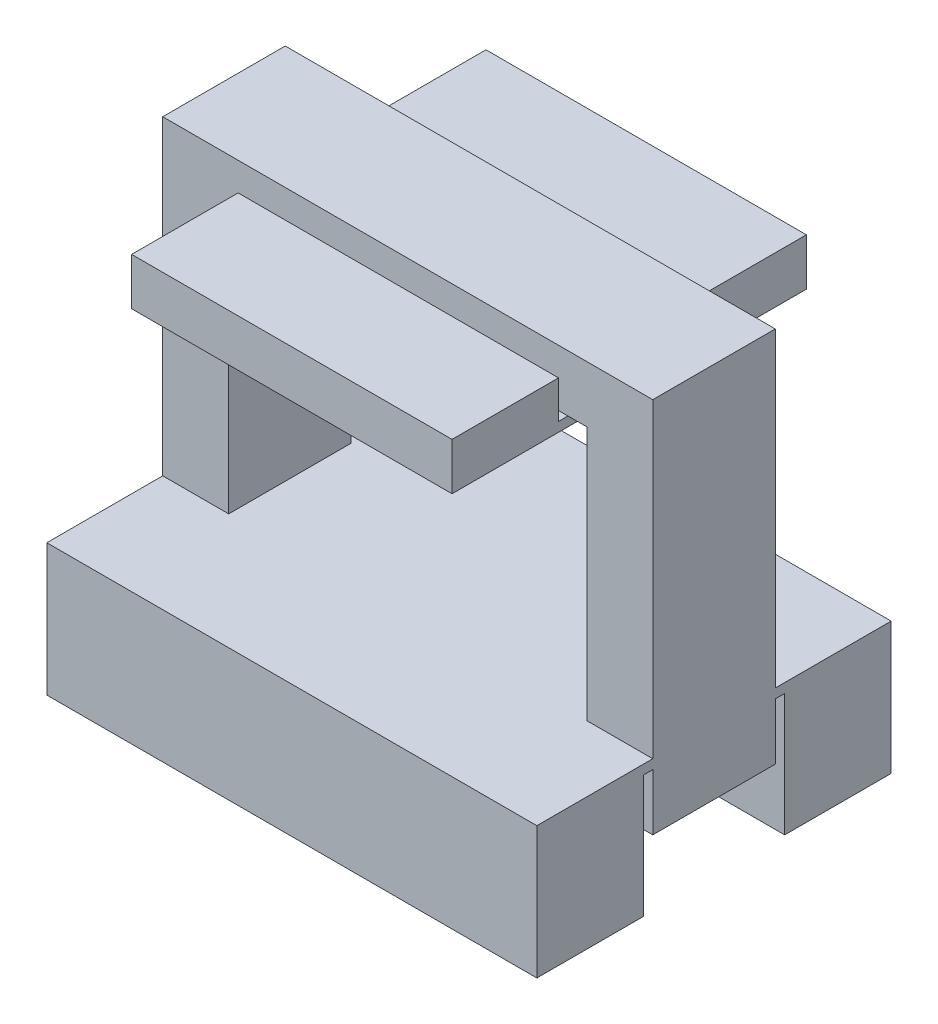
ISO-10303-21;
HEADER;
FILE_DESCRIPTION(('STEP AP214'),'2;1');
FILE_NAME('part.step','',(''),(''),'','','');
FILE_SCHEMA(('AUTOMOTIVE_DESIGN { 1 0 10303 214 1 1 1 1 }'));
ENDSEC;
DATA;
#1=APPLICATION_CONTEXT('core data for automotive mechanical design processes');
#2=APPLICATION_PROTOCOL_DEFINITION('international standard','automotive_design',2000,#1);
#3=PRODUCT_CONTEXT('',#1,'mechanical');
#4=PRODUCT('Part','Part','',(#3));
#5=PRODUCT_RELATED_PRODUCT_CATEGORY('part','',(#4));
#6=PRODUCT_DEFINITION_FORMATION('','',#4);
#7=PRODUCT_DEFINITION_CONTEXT('part definition',#1,'design');
#8=PRODUCT_DEFINITION('design','',#6,#7);
#9=PRODUCT_DEFINITION_SHAPE('','',#8);
#10=(LENGTH_UNIT() NAMED_UNIT(*) SI_UNIT(.MILLI.,.METRE.));
#11=(NAMED_UNIT(*) PLANE_ANGLE_UNIT() SI_UNIT($,.RADIAN.));
#12=(NAMED_UNIT(*) SI_UNIT($,.STERADIAN.) SOLID_ANGLE_UNIT());
#13=UNCERTAINTY_MEASURE_WITH_UNIT(LENGTH_MEASURE(1.E-05),#10,'distance_accuracy_value','');
#14=(GEOMETRIC_REPRESENTATION_CONTEXT(3) GLOBAL_UNCERTAINTY_ASSIGNED_CONTEXT((#13)) GLOBAL_UNIT_ASSIGNED_CONTEXT((#10,
#11,#12)) REPRESENTATION_CONTEXT('',''));
#15=CARTESIAN_POINT('',(0.,0.,0.));
#16=DIRECTION('',(0.,0.,1.));
#17=DIRECTION('',(1.,0.,0.));
#18=AXIS2_PLACEMENT_3D('',#15,#16,#17);
#19=CARTESIAN_POINT('',(13.,-3.5,9.4));
#20=DIRECTION('',(0.,1.,0.));
#21=DIRECTION('',(-1.,0.,0.));
#22=AXIS2_PLACEMENT_3D('',#19,#20,#21);
#23=PLANE('',#22);
#24=DIRECTION('',(0.,0.,-1.));
#25=VECTOR('',#24,1.);
#26=CARTESIAN_POINT('',(13.,-3.5,-9.4));
#27=LINE('',#26,#25);
#28=CARTESIAN_POINT('',(13.,-3.5,-3.75));
#29=VERTEX_POINT('',#28);
#30=CARTESIAN_POINT('',(13.,-3.5,-9.4));
#31=VERTEX_POINT('',#30);
#32=EDGE_CURVE('E314',#29,#31,#27,.T.);
#33=ORIENTED_EDGE('',*,*,#32,.F.);
#34=DIRECTION('',(1.,0.,0.));
#35=VECTOR('',#34,1.);
#36=CARTESIAN_POINT('',(-13.,-3.5,-3.75));
#37=LINE('',#36,#35);
#38=CARTESIAN_POINT('',(-13.,-3.5,-3.75));
#39=VERTEX_POINT('',#38);
#40=EDGE_CURVE('E296',#39,#29,#37,.T.);
#41=ORIENTED_EDGE('',*,*,#40,.F.);
#42=DIRECTION('',(0.,0.,1.));
#43=VECTOR('',#42,1.);
#44=CARTESIAN_POINT('',(-13.,-3.5,-9.4));
#45=LINE('',#44,#43);
#46=CARTESIAN_POINT('',(-13.,-3.5,-9.4));
#47=VERTEX_POINT('',#46);
#48=EDGE_CURVE('E322',#47,#39,#45,.T.);
#49=ORIENTED_EDGE('',*,*,#48,.F.);
#50=DIRECTION('',(-1.,0.,0.));
#51=VECTOR('',#50,1.);
#52=CARTESIAN_POINT('',(-13.,-3.5,-9.4));
#53=LINE('',#52,#51);
#54=EDGE_CURVE('E318',#31,#47,#53,.T.);
#55=ORIENTED_EDGE('',*,*,#54,.F.);
#56=EDGE_LOOP('',(#33,#41,#49,#55));
#57=FACE_BOUND('',#56,.T.);
#58=ADVANCED_FACE('F38',(#57),#23,.F.);
#59=CARTESIAN_POINT('',(9.5,17.,-3.25));
#60=DIRECTION('',(0.,1.,0.));
#61=DIRECTION('',(0.,0.,1.));
#62=AXIS2_PLACEMENT_3D('',#59,#60,#61);
#63=PLANE('',#62);
#64=DIRECTION('',(-1.,0.,0.));
#65=VECTOR('',#64,1.);
#66=CARTESIAN_POINT('',(9.5,17.,3.25));
#67=LINE('',#66,#65);
#68=CARTESIAN_POINT('',(9.5,17.,3.25));
#69=VERTEX_POINT('',#68);
#70=CARTESIAN_POINT('',(8.5,17.,3.25));
#71=VERTEX_POINT('',#70);
#72=EDGE_CURVE('E418',#69,#71,#67,.T.);
#73=ORIENTED_EDGE('',*,*,#72,.T.);
#74=DIRECTION('',(0.,0.,-1.));
#75=VECTOR('',#74,1.);
#76=CARTESIAN_POINT('',(8.5,17.,-3.25));
#77=LINE('',#76,#75);
#78=CARTESIAN_POINT('',(8.5,17.,-3.25));
#79=VERTEX_POINT('',#78);
#80=EDGE_CURVE('E452',#71,#79,#77,.T.);
#81=ORIENTED_EDGE('',*,*,#80,.T.);
#82=DIRECTION('',(-1.,0.,0.));
#83=VECTOR('',#82,1.);
#84=CARTESIAN_POINT('',(9.5,17.,-3.25));
#85=LINE('',#84,#83);
#86=CARTESIAN_POINT('',(9.5,17.,-3.25));
#87=VERTEX_POINT('',#86);
#88=EDGE_CURVE('E409',#87,#79,#85,.T.);
#89=ORIENTED_EDGE('',*,*,#88,.F.);
#90=DIRECTION('',(0.,0.,1.));
#91=VECTOR('',#90,1.);
#92=CARTESIAN_POINT('',(9.5,17.,-3.25));
#93=LINE('',#92,#91);
#94=EDGE_CURVE('E415',#87,#69,#93,.T.);
#95=ORIENTED_EDGE('',*,*,#94,.T.);
#96=EDGE_LOOP('',(#73,#81,#89,#95));
#97=FACE_BOUND('',#96,.T.);
#98=ADVANCED_FACE('F513',(#97),#63,.F.);
#99=CARTESIAN_POINT('',(13.,20.,3.25));
#100=DIRECTION('',(-1.,0.,0.));
#101=DIRECTION('',(0.,0.,1.));
#102=AXIS2_PLACEMENT_3D('',#99,#100,#101);
#103=PLANE('',#102);
#104=DIRECTION('',(0.,0.,1.));
#105=VECTOR('',#104,1.);
#106=CARTESIAN_POINT('',(13.,3.,-3.25));
#107=LINE('',#106,#105);
#108=CARTESIAN_POINT('',(13.,3.,-3.75));
#109=VERTEX_POINT('',#108);
#110=CARTESIAN_POINT('',(13.,3.,-3.25));
#111=VERTEX_POINT('',#110);
#112=EDGE_CURVE('E264',#109,#111,#107,.T.);
#113=ORIENTED_EDGE('',*,*,#112,.F.);
#114=DIRECTION('',(0.,1.,0.));
#115=VECTOR('',#114,1.);
#116=CARTESIAN_POINT('',(13.,3.,-3.75));
#117=LINE('',#116,#115);
#118=EDGE_CURVE('E284',#29,#109,#117,.T.);
#119=ORIENTED_EDGE('',*,*,#118,.F.);
#120=ORIENTED_EDGE('',*,*,#32,.T.);
#121=DIRECTION('',(0.,1.,0.));
#122=VECTOR('',#121,1.);
#123=CARTESIAN_POINT('',(13.,-3.5,-9.4));
#124=LINE('',#123,#122);
#125=CARTESIAN_POINT('',(13.,3.5,-9.4));
#126=VERTEX_POINT('',#125);
#127=EDGE_CURVE('E327',#31,#126,#124,.T.);
#128=ORIENTED_EDGE('',*,*,#127,.T.);
#129=DIRECTION('',(0.,0.,-1.));
#130=VECTOR('',#129,1.);
#131=CARTESIAN_POINT('',(13.,3.5,-9.4));
#132=LINE('',#131,#130);
#133=CARTESIAN_POINT('',(13.,3.5,-3.25));
#134=VERTEX_POINT('',#133);
#135=EDGE_CURVE('E291',#134,#126,#132,.T.);
#136=ORIENTED_EDGE('',*,*,#135,.F.);
#137=DIRECTION('',(0.,-1.,0.));
#138=VECTOR('',#137,1.);
#139=CARTESIAN_POINT('',(13.,20.,-3.25));
#140=LINE('',#139,#138);
#141=CARTESIAN_POINT('',(13.,20.,-3.25));
#142=VERTEX_POINT('',#141);
#143=EDGE_CURVE('E446',#142,#134,#140,.T.);
#144=ORIENTED_EDGE('',*,*,#143,.F.);
#145=DIRECTION('',(0.,0.,-1.));
#146=VECTOR('',#145,1.);
#147=CARTESIAN_POINT('',(13.,20.,3.25));
#148=LINE('',#147,#146);
#149=CARTESIAN_POINT('',(13.,20.,3.25));
#150=VERTEX_POINT('',#149);
#151=EDGE_CURVE('E426',#150,#142,#148,.T.);
#152=ORIENTED_EDGE('',*,*,#151,.F.);
#153=DIRECTION('',(0.,-1.,0.));
#154=VECTOR('',#153,1.);
#155=CARTESIAN_POINT('',(13.,20.,3.25));
#156=LINE('',#155,#154);
#157=CARTESIAN_POINT('',(13.,3.5,3.25));
#158=VERTEX_POINT('',#157);
#159=EDGE_CURVE('E437',#150,#158,#156,.T.);
#160=ORIENTED_EDGE('',*,*,#159,.T.);
#161=CARTESIAN_POINT('',(13.,3.5,9.4));
#162=VERTEX_POINT('',#161);
#163=EDGE_CURVE('E303',#162,#158,#132,.T.);
#164=ORIENTED_EDGE('',*,*,#163,.F.);
#165=DIRECTION('',(0.,1.,0.));
#166=VECTOR('',#165,1.);
#167=CARTESIAN_POINT('',(13.,-3.5,9.4));
#168=LINE('',#167,#166);
#169=CARTESIAN_POINT('',(13.,-3.5,9.4));
#170=VERTEX_POINT('',#169);
#171=EDGE_CURVE('E328',#170,#162,#168,.T.);
#172=ORIENTED_EDGE('',*,*,#171,.F.);
#173=CARTESIAN_POINT('',(13.,-3.5,3.75));
#174=VERTEX_POINT('',#173);
#175=EDGE_CURVE('E315',#170,#174,#27,.T.);
#176=ORIENTED_EDGE('',*,*,#175,.T.);
#177=DIRECTION('',(0.,-1.,0.));
#178=VECTOR('',#177,1.);
#179=CARTESIAN_POINT('',(13.,3.,3.75));
#180=LINE('',#179,#178);
#181=CARTESIAN_POINT('',(13.,3.,3.75));
#182=VERTEX_POINT('',#181);
#183=EDGE_CURVE('E53',#182,#174,#180,.T.);
#184=ORIENTED_EDGE('',*,*,#183,.F.);
#185=DIRECTION('',(0.,0.,1.));
#186=VECTOR('',#185,1.);
#187=CARTESIAN_POINT('',(13.,3.,3.25));
#188=LINE('',#187,#186);
#189=CARTESIAN_POINT('',(13.,3.,3.25));
#190=VERTEX_POINT('',#189);
#191=EDGE_CURVE('E280',#190,#182,#188,.T.);
#192=ORIENTED_EDGE('',*,*,#191,.F.);
#193=DIRECTION('',(0.,1.,0.));
#194=VECTOR('',#193,1.);
#195=CARTESIAN_POINT('',(13.,0.,3.25));
#196=LINE('',#195,#194);
#197=CARTESIAN_POINT('',(13.,0.,3.25));
#198=VERTEX_POINT('',#197);
#199=EDGE_CURVE('E278',#198,#190,#196,.T.);
#200=ORIENTED_EDGE('',*,*,#199,.F.);
#201=DIRECTION('',(0.,0.,1.));
#202=VECTOR('',#201,1.);
#203=CARTESIAN_POINT('',(13.,0.,3.25));
#204=LINE('',#203,#202);
#205=CARTESIAN_POINT('',(13.,0.,-3.25));
#206=VERTEX_POINT('',#205);
#207=EDGE_CURVE('E242',#206,#198,#204,.T.);
#208=ORIENTED_EDGE('',*,*,#207,.F.);
#209=DIRECTION('',(0.,-1.,0.));
#210=VECTOR('',#209,1.);
#211=CARTESIAN_POINT('',(13.,0.,-3.25));
#212=LINE('',#211,#210);
#213=EDGE_CURVE('E261',#111,#206,#212,.T.);
#214=ORIENTED_EDGE('',*,*,#213,.F.);
#215=EDGE_LOOP('',(#113,#119,#120,#128,#136,#144,#152,#160,#164,#172,#176,#184,#192,#200,#208,#214));
#216=FACE_BOUND('',#215,.T.);
#217=ADVANCED_FACE('F40',(#216),#103,.F.);
#218=CARTESIAN_POINT('',(-13.,20.,-3.25));
#219=DIRECTION('',(0.,0.,1.));
#220=DIRECTION('',(1.,0.,0.));
#221=AXIS2_PLACEMENT_3D('',#218,#219,#220);
#222=PLANE('',#221);
#223=ORIENTED_EDGE('',*,*,#143,.T.);
#224=DIRECTION('',(-1.,0.,0.));
#225=VECTOR('',#224,1.);
#226=CARTESIAN_POINT('',(-13.,3.5,-3.25));
#227=LINE('',#226,#225);
#228=CARTESIAN_POINT('',(9.5,3.5,-3.25));
#229=VERTEX_POINT('',#228);
#230=EDGE_CURVE('E344',#134,#229,#227,.T.);
#231=ORIENTED_EDGE('',*,*,#230,.T.);
#232=DIRECTION('',(0.,1.,0.));
#233=VECTOR('',#232,1.);
#234=CARTESIAN_POINT('',(9.5,17.,-3.25));
#235=LINE('',#234,#233);
#236=EDGE_CURVE('E405',#229,#87,#235,.T.);
#237=ORIENTED_EDGE('',*,*,#236,.T.);
#238=ORIENTED_EDGE('',*,*,#88,.T.);
#239=DIRECTION('',(1.,0.,0.));
#240=VECTOR('',#239,1.);
#241=CARTESIAN_POINT('',(-13.,17.,-3.25));
#242=LINE('',#241,#240);
#243=CARTESIAN_POINT('',(-8.5,17.,-3.25));
#244=VERTEX_POINT('',#243);
#245=EDGE_CURVE('E352',#244,#79,#242,.T.);
#246=ORIENTED_EDGE('',*,*,#245,.F.);
#247=CARTESIAN_POINT('',(-9.5,17.,-3.25));
#248=VERTEX_POINT('',#247);
#249=EDGE_CURVE('E407',#244,#248,#85,.T.);
#250=ORIENTED_EDGE('',*,*,#249,.T.);
#251=DIRECTION('',(0.,-1.,0.));
#252=VECTOR('',#251,1.);
#253=CARTESIAN_POINT('',(-9.5,17.,-3.25));
#254=LINE('',#253,#252);
#255=CARTESIAN_POINT('',(-9.5,3.5,-3.25));
#256=VERTEX_POINT('',#255);
#257=EDGE_CURVE('E412',#248,#256,#254,.T.);
#258=ORIENTED_EDGE('',*,*,#257,.T.);
#259=CARTESIAN_POINT('',(-13.,3.5,-3.25));
#260=VERTEX_POINT('',#259);
#261=EDGE_CURVE('E340',#256,#260,#227,.T.);
#262=ORIENTED_EDGE('',*,*,#261,.T.);
#263=DIRECTION('',(0.,-1.,0.));
#264=VECTOR('',#263,1.);
#265=CARTESIAN_POINT('',(-13.,20.,-3.25));
#266=LINE('',#265,#264);
#267=CARTESIAN_POINT('',(-13.,20.,-3.25));
#268=VERTEX_POINT('',#267);
#269=EDGE_CURVE('E443',#268,#260,#266,.T.);
#270=ORIENTED_EDGE('',*,*,#269,.F.);
#271=DIRECTION('',(-1.,0.,0.));
#272=VECTOR('',#271,1.);
#273=CARTESIAN_POINT('',(-13.,20.,-3.25));
#274=LINE('',#273,#272);
#275=EDGE_CURVE('E431',#142,#268,#274,.T.);
#276=ORIENTED_EDGE('',*,*,#275,.F.);
#277=EDGE_LOOP('',(#223,#231,#237,#238,#246,#250,#258,#262,#270,#276));
#278=FACE_BOUND('',#277,.T.);
#279=ADVANCED_FACE('F470',(#278),#222,.F.);
#280=CARTESIAN_POINT('',(-13.,20.,3.25));
#281=DIRECTION('',(1.,0.,0.));
#282=DIRECTION('',(0.,0.,-1.));
#283=AXIS2_PLACEMENT_3D('',#280,#281,#282);
#284=PLANE('',#283);
#285=ORIENTED_EDGE('',*,*,#48,.T.);
#286=DIRECTION('',(0.,1.,0.));
#287=VECTOR('',#286,1.);
#288=CARTESIAN_POINT('',(-13.,3.,-3.75));
#289=LINE('',#288,#287);
#290=CARTESIAN_POINT('',(-13.,3.,-3.75));
#291=VERTEX_POINT('',#290);
#292=EDGE_CURVE('E271',#39,#291,#289,.T.);
#293=ORIENTED_EDGE('',*,*,#292,.T.);
#294=DIRECTION('',(0.,0.,1.));
#295=VECTOR('',#294,1.);
#296=CARTESIAN_POINT('',(-13.,3.,-3.25));
#297=LINE('',#296,#295);
#298=CARTESIAN_POINT('',(-13.,3.,-3.25));
#299=VERTEX_POINT('',#298);
#300=EDGE_CURVE('E274',#291,#299,#297,.T.);
#301=ORIENTED_EDGE('',*,*,#300,.T.);
#302=DIRECTION('',(0.,-1.,0.));
#303=VECTOR('',#302,1.);
#304=CARTESIAN_POINT('',(-13.,0.,-3.25));
#305=LINE('',#304,#303);
#306=CARTESIAN_POINT('',(-13.,0.,-3.25));
#307=VERTEX_POINT('',#306);
#308=EDGE_CURVE('E247',#299,#307,#305,.T.);
#309=ORIENTED_EDGE('',*,*,#308,.T.);
#310=DIRECTION('',(0.,0.,1.));
#311=VECTOR('',#310,1.);
#312=CARTESIAN_POINT('',(-13.,0.,3.25));
#313=LINE('',#312,#311);
#314=CARTESIAN_POINT('',(-13.,0.,3.25));
#315=VERTEX_POINT('',#314);
#316=EDGE_CURVE('E239',#307,#315,#313,.T.);
#317=ORIENTED_EDGE('',*,*,#316,.T.);
#318=DIRECTION('',(0.,1.,0.));
#319=VECTOR('',#318,1.);
#320=CARTESIAN_POINT('',(-13.,0.,3.25));
#321=LINE('',#320,#319);
#322=CARTESIAN_POINT('',(-13.,3.,3.25));
#323=VERTEX_POINT('',#322);
#324=EDGE_CURVE('E250',#315,#323,#321,.T.);
#325=ORIENTED_EDGE('',*,*,#324,.T.);
#326=DIRECTION('',(0.,0.,1.));
#327=VECTOR('',#326,1.);
#328=CARTESIAN_POINT('',(-13.,3.,3.25));
#329=LINE('',#328,#327);
#330=CARTESIAN_POINT('',(-13.,3.,3.75));
#331=VERTEX_POINT('',#330);
#332=EDGE_CURVE('E255',#323,#331,#329,.T.);
#333=ORIENTED_EDGE('',*,*,#332,.T.);
#334=DIRECTION('',(0.,-1.,0.));
#335=VECTOR('',#334,1.);
#336=CARTESIAN_POINT('',(-13.,3.,3.75));
#337=LINE('',#336,#335);
#338=CARTESIAN_POINT('',(-13.,-3.5,3.75));
#339=VERTEX_POINT('',#338);
#340=EDGE_CURVE('E268',#331,#339,#337,.T.);
#341=ORIENTED_EDGE('',*,*,#340,.T.);
#342=CARTESIAN_POINT('',(-13.,-3.5,9.4));
#343=VERTEX_POINT('',#342);
#344=EDGE_CURVE('E321',#339,#343,#45,.T.);
#345=ORIENTED_EDGE('',*,*,#344,.T.);
#346=DIRECTION('',(0.,1.,0.));
#347=VECTOR('',#346,1.);
#348=CARTESIAN_POINT('',(-13.,-3.5,9.4));
#349=LINE('',#348,#347);
#350=CARTESIAN_POINT('',(-13.,3.5,9.4));
#351=VERTEX_POINT('',#350);
#352=EDGE_CURVE('E331',#343,#351,#349,.T.);
#353=ORIENTED_EDGE('',*,*,#352,.T.);
#354=DIRECTION('',(0.,0.,1.));
#355=VECTOR('',#354,1.);
#356=CARTESIAN_POINT('',(-13.,3.5,-9.4));
#357=LINE('',#356,#355);
#358=CARTESIAN_POINT('',(-13.,3.5,3.25));
#359=VERTEX_POINT('',#358);
#360=EDGE_CURVE('E308',#359,#351,#357,.T.);
#361=ORIENTED_EDGE('',*,*,#360,.F.);
#362=DIRECTION('',(0.,-1.,0.));
#363=VECTOR('',#362,1.);
#364=CARTESIAN_POINT('',(-13.,20.,3.25));
#365=LINE('',#364,#363);
#366=CARTESIAN_POINT('',(-13.,20.,3.25));
#367=VERTEX_POINT('',#366);
#368=EDGE_CURVE('E440',#367,#359,#365,.T.);
#369=ORIENTED_EDGE('',*,*,#368,.F.);
#370=DIRECTION('',(0.,0.,1.));
#371=VECTOR('',#370,1.);
#372=CARTESIAN_POINT('',(-13.,20.,3.25));
#373=LINE('',#372,#371);
#374=EDGE_CURVE('E433',#268,#367,#373,.T.);
#375=ORIENTED_EDGE('',*,*,#374,.F.);
#376=ORIENTED_EDGE('',*,*,#269,.T.);
#377=CARTESIAN_POINT('',(-13.,3.5,-9.4));
#378=VERTEX_POINT('',#377);
#379=EDGE_CURVE('E309',#378,#260,#357,.T.);
#380=ORIENTED_EDGE('',*,*,#379,.F.);
#381=DIRECTION('',(0.,1.,0.));
#382=VECTOR('',#381,1.);
#383=CARTESIAN_POINT('',(-13.,-3.5,-9.4));
#384=LINE('',#383,#382);
#385=EDGE_CURVE('E334',#47,#378,#384,.T.);
#386=ORIENTED_EDGE('',*,*,#385,.F.);
#387=EDGE_LOOP('',(#285,#293,#301,#309,#317,#325,#333,#341,#345,#353,#361,#369,#375,#376,#380,#386));
#388=FACE_BOUND('',#387,.T.);
#389=ADVANCED_FACE('F258',(#388),#284,.F.);
#390=CARTESIAN_POINT('',(-13.,20.,3.25));
#391=DIRECTION('',(0.,0.,-1.));
#392=DIRECTION('',(-1.,0.,0.));
#393=AXIS2_PLACEMENT_3D('',#390,#391,#392);
#394=PLANE('',#393);
#395=ORIENTED_EDGE('',*,*,#368,.T.);
#396=DIRECTION('',(1.,0.,0.));
#397=VECTOR('',#396,1.);
#398=CARTESIAN_POINT('',(-13.,3.5,3.25));
#399=LINE('',#398,#397);
#400=CARTESIAN_POINT('',(-9.5,3.5,3.25));
#401=VERTEX_POINT('',#400);
#402=EDGE_CURVE('E330',#359,#401,#399,.T.);
#403=ORIENTED_EDGE('',*,*,#402,.T.);
#404=DIRECTION('',(0.,-1.,0.));
#405=VECTOR('',#404,1.);
#406=CARTESIAN_POINT('',(-9.5,17.,3.25));
#407=LINE('',#406,#405);
#408=CARTESIAN_POINT('',(-9.5,17.,3.25));
#409=VERTEX_POINT('',#408);
#410=EDGE_CURVE('E408',#409,#401,#407,.T.);
#411=ORIENTED_EDGE('',*,*,#410,.F.);
#412=CARTESIAN_POINT('',(-8.5,17.,3.25));
#413=VERTEX_POINT('',#412);
#414=EDGE_CURVE('E417',#413,#409,#67,.T.);
#415=ORIENTED_EDGE('',*,*,#414,.F.);
#416=DIRECTION('',(1.,0.,0.));
#417=VECTOR('',#416,1.);
#418=CARTESIAN_POINT('',(-13.,17.,3.25));
#419=LINE('',#418,#417);
#420=EDGE_CURVE('E364',#413,#71,#419,.T.);
#421=ORIENTED_EDGE('',*,*,#420,.T.);
#422=ORIENTED_EDGE('',*,*,#72,.F.);
#423=DIRECTION('',(0.,1.,0.));
#424=VECTOR('',#423,1.);
#425=CARTESIAN_POINT('',(9.5,17.,3.25));
#426=LINE('',#425,#424);
#427=CARTESIAN_POINT('',(9.5,3.5,3.25));
#428=VERTEX_POINT('',#427);
#429=EDGE_CURVE('E399',#428,#69,#426,.T.);
#430=ORIENTED_EDGE('',*,*,#429,.F.);
#431=EDGE_CURVE('E61',#428,#158,#399,.T.);
#432=ORIENTED_EDGE('',*,*,#431,.T.);
#433=ORIENTED_EDGE('',*,*,#159,.F.);
#434=DIRECTION('',(1.,0.,0.));
#435=VECTOR('',#434,1.);
#436=CARTESIAN_POINT('',(-13.,20.,3.25));
#437=LINE('',#436,#435);
#438=EDGE_CURVE('E435',#367,#150,#437,.T.);
#439=ORIENTED_EDGE('',*,*,#438,.F.);
#440=EDGE_LOOP('',(#395,#403,#411,#415,#421,#422,#430,#432,#433,#439));
#441=FACE_BOUND('',#440,.T.);
#442=ADVANCED_FACE('F485',(#441),#394,.F.);
#443=CARTESIAN_POINT('',(13.,20.,-3.25));
#444=DIRECTION('',(0.,-1.,0.));
#445=DIRECTION('',(0.,0.,-1.));
#446=AXIS2_PLACEMENT_3D('',#443,#444,#445);
#447=PLANE('',#446);
#448=ORIENTED_EDGE('',*,*,#151,.T.);
#449=ORIENTED_EDGE('',*,*,#275,.T.);
#450=ORIENTED_EDGE('',*,*,#374,.T.);
#451=ORIENTED_EDGE('',*,*,#438,.T.);
#452=EDGE_LOOP('',(#448,#449,#450,#451));
#453=FACE_BOUND('',#452,.T.);
#454=ADVANCED_FACE('F693',(#453),#447,.F.);
#455=CARTESIAN_POINT('',(9.5,17.,-3.25));
#456=DIRECTION('',(1.,0.,0.));
#457=DIRECTION('',(0.,1.,0.));
#458=AXIS2_PLACEMENT_3D('',#455,#456,#457);
#459=PLANE('',#458);
#460=ORIENTED_EDGE('',*,*,#236,.F.);
#461=DIRECTION('',(0.,0.,1.));
#462=VECTOR('',#461,1.);
#463=CARTESIAN_POINT('',(9.5,3.5,-3.25));
#464=LINE('',#463,#462);
#465=EDGE_CURVE('E343',#229,#428,#464,.T.);
#466=ORIENTED_EDGE('',*,*,#465,.T.);
#467=ORIENTED_EDGE('',*,*,#429,.T.);
#468=ORIENTED_EDGE('',*,*,#94,.F.);
#469=EDGE_LOOP('',(#460,#466,#467,#468));
#470=FACE_BOUND('',#469,.T.);
#471=ADVANCED_FACE('F511',(#470),#459,.F.);
#472=CARTESIAN_POINT('',(-9.5,17.,-3.25));
#473=DIRECTION('',(-1.,0.,0.));
#474=DIRECTION('',(0.,0.,1.));
#475=AXIS2_PLACEMENT_3D('',#472,#473,#474);
#476=PLANE('',#475);
#477=ORIENTED_EDGE('',*,*,#410,.T.);
#478=DIRECTION('',(0.,0.,-1.));
#479=VECTOR('',#478,1.);
#480=CARTESIAN_POINT('',(-9.5,3.5,-3.25));
#481=LINE('',#480,#479);
#482=EDGE_CURVE('E11',#401,#256,#481,.T.);
#483=ORIENTED_EDGE('',*,*,#482,.T.);
#484=ORIENTED_EDGE('',*,*,#257,.F.);
#485=DIRECTION('',(0.,0.,1.));
#486=VECTOR('',#485,1.);
#487=CARTESIAN_POINT('',(-9.5,17.,-3.25));
#488=LINE('',#487,#486);
#489=EDGE_CURVE('E423',#248,#409,#488,.T.);
#490=ORIENTED_EDGE('',*,*,#489,.T.);
#491=EDGE_LOOP('',(#477,#483,#484,#490));
#492=FACE_BOUND('',#491,.T.);
#493=ADVANCED_FACE('F483',(#492),#476,.F.);
#494=ORIENTED_EDGE('',*,*,#249,.F.);
#495=DIRECTION('',(0.,0.,1.));
#496=VECTOR('',#495,1.);
#497=CARTESIAN_POINT('',(-8.5,17.,-3.25));
#498=LINE('',#497,#496);
#499=EDGE_CURVE('E449',#244,#413,#498,.T.);
#500=ORIENTED_EDGE('',*,*,#499,.T.);
#501=ORIENTED_EDGE('',*,*,#414,.T.);
#502=ORIENTED_EDGE('',*,*,#489,.F.);
#503=EDGE_LOOP('',(#494,#500,#501,#502));
#504=FACE_BOUND('',#503,.T.);
#505=ADVANCED_FACE('F480',(#504),#63,.F.);
#506=CARTESIAN_POINT('',(8.5,19.,9.4));
#507=DIRECTION('',(0.,1.,0.));
#508=DIRECTION('',(0.,0.,1.));
#509=AXIS2_PLACEMENT_3D('',#506,#507,#508);
#510=PLANE('',#509);
#511=DIRECTION('',(1.,0.,0.));
#512=VECTOR('',#511,1.);
#513=CARTESIAN_POINT('',(-13.,19.,-3.75));
#514=LINE('',#513,#512);
#515=CARTESIAN_POINT('',(-8.5,19.,-3.75));
#516=VERTEX_POINT('',#515);
#517=CARTESIAN_POINT('',(8.5,19.,-3.75));
#518=VERTEX_POINT('',#517);
#519=EDGE_CURVE('E355',#516,#518,#514,.T.);
#520=ORIENTED_EDGE('',*,*,#519,.T.);
#521=DIRECTION('',(0.,0.,1.));
#522=VECTOR('',#521,1.);
#523=CARTESIAN_POINT('',(8.5,19.,-9.4));
#524=LINE('',#523,#522);
#525=CARTESIAN_POINT('',(8.5,19.,-9.4));
#526=VERTEX_POINT('',#525);
#527=EDGE_CURVE('E383',#526,#518,#524,.T.);
#528=ORIENTED_EDGE('',*,*,#527,.F.);
#529=DIRECTION('',(1.,0.,0.));
#530=VECTOR('',#529,1.);
#531=CARTESIAN_POINT('',(-8.5,19.,-9.4));
#532=LINE('',#531,#530);
#533=CARTESIAN_POINT('',(-8.5,19.,-9.4));
#534=VERTEX_POINT('',#533);
#535=EDGE_CURVE('E393',#534,#526,#532,.T.);
#536=ORIENTED_EDGE('',*,*,#535,.F.);
#537=DIRECTION('',(0.,0.,-1.));
#538=VECTOR('',#537,1.);
#539=CARTESIAN_POINT('',(-8.5,19.,-9.4));
#540=LINE('',#539,#538);
#541=EDGE_CURVE('E389',#516,#534,#540,.T.);
#542=ORIENTED_EDGE('',*,*,#541,.F.);
#543=EDGE_LOOP('',(#520,#528,#536,#542));
#544=FACE_BOUND('',#543,.T.);
#545=ADVANCED_FACE('F525',(#544),#510,.T.);
#546=DIRECTION('',(1.,0.,0.));
#547=VECTOR('',#546,1.);
#548=CARTESIAN_POINT('',(-13.,19.,3.75));
#549=LINE('',#548,#547);
#550=CARTESIAN_POINT('',(-8.5,19.,3.75));
#551=VERTEX_POINT('',#550);
#552=CARTESIAN_POINT('',(8.5,19.,3.75));
#553=VERTEX_POINT('',#552);
#554=EDGE_CURVE('E368',#551,#553,#549,.T.);
#555=ORIENTED_EDGE('',*,*,#554,.F.);
#556=CARTESIAN_POINT('',(-8.5,19.,9.4));
#557=VERTEX_POINT('',#556);
#558=EDGE_CURVE('E390',#557,#551,#540,.T.);
#559=ORIENTED_EDGE('',*,*,#558,.F.);
#560=DIRECTION('',(-1.,0.,0.));
#561=VECTOR('',#560,1.);
#562=CARTESIAN_POINT('',(-8.5,19.,9.4));
#563=LINE('',#562,#561);
#564=CARTESIAN_POINT('',(8.5,19.,9.4));
#565=VERTEX_POINT('',#564);
#566=EDGE_CURVE('E386',#565,#557,#563,.T.);
#567=ORIENTED_EDGE('',*,*,#566,.F.);
#568=EDGE_CURVE('E382',#553,#565,#524,.T.);
#569=ORIENTED_EDGE('',*,*,#568,.F.);
#570=EDGE_LOOP('',(#555,#559,#567,#569));
#571=FACE_BOUND('',#570,.T.);
#572=ADVANCED_FACE('F544',(#571),#510,.T.);
#573=CARTESIAN_POINT('',(8.5,19.,-9.4));
#574=DIRECTION('',(1.,0.,0.));
#575=DIRECTION('',(0.,0.,-1.));
#576=AXIS2_PLACEMENT_3D('',#573,#574,#575);
#577=PLANE('',#576);
#578=DIRECTION('',(0.,0.,-1.));
#579=VECTOR('',#578,1.);
#580=CARTESIAN_POINT('',(8.5,17.,-3.25));
#581=LINE('',#580,#579);
#582=CARTESIAN_POINT('',(8.5,17.,-3.75));
#583=VERTEX_POINT('',#582);
#584=EDGE_CURVE('E346',#79,#583,#581,.T.);
#585=ORIENTED_EDGE('',*,*,#584,.F.);
#586=ORIENTED_EDGE('',*,*,#80,.F.);
#587=DIRECTION('',(0.,0.,-1.));
#588=VECTOR('',#587,1.);
#589=CARTESIAN_POINT('',(8.5,17.,3.25));
#590=LINE('',#589,#588);
#591=CARTESIAN_POINT('',(8.5,17.,3.75));
#592=VERTEX_POINT('',#591);
#593=EDGE_CURVE('E354',#592,#71,#590,.T.);
#594=ORIENTED_EDGE('',*,*,#593,.F.);
#595=DIRECTION('',(0.,-1.,0.));
#596=VECTOR('',#595,1.);
#597=CARTESIAN_POINT('',(8.5,17.,3.75));
#598=LINE('',#597,#596);
#599=EDGE_CURVE('E361',#553,#592,#598,.T.);
#600=ORIENTED_EDGE('',*,*,#599,.F.);
#601=ORIENTED_EDGE('',*,*,#568,.T.);
#602=DIRECTION('',(0.,-1.,0.));
#603=VECTOR('',#602,1.);
#604=CARTESIAN_POINT('',(8.5,19.,9.4));
#605=LINE('',#604,#603);
#606=CARTESIAN_POINT('',(8.5,16.5,9.4));
#607=VERTEX_POINT('',#606);
#608=EDGE_CURVE('E396',#565,#607,#605,.T.);
#609=ORIENTED_EDGE('',*,*,#608,.T.);
#610=DIRECTION('',(0.,0.,1.));
#611=VECTOR('',#610,1.);
#612=CARTESIAN_POINT('',(8.5,16.5,-9.4));
#613=LINE('',#612,#611);
#614=CARTESIAN_POINT('',(8.5,16.5,-9.4));
#615=VERTEX_POINT('',#614);
#616=EDGE_CURVE('E367',#615,#607,#613,.T.);
#617=ORIENTED_EDGE('',*,*,#616,.F.);
#618=DIRECTION('',(0.,-1.,0.));
#619=VECTOR('',#618,1.);
#620=CARTESIAN_POINT('',(8.5,19.,-9.4));
#621=LINE('',#620,#619);
#622=EDGE_CURVE('E397',#526,#615,#621,.T.);
#623=ORIENTED_EDGE('',*,*,#622,.F.);
#624=ORIENTED_EDGE('',*,*,#527,.T.);
#625=DIRECTION('',(0.,1.,0.));
#626=VECTOR('',#625,1.);
#627=CARTESIAN_POINT('',(8.5,17.,-3.75));
#628=LINE('',#627,#626);
#629=EDGE_CURVE('E349',#583,#518,#628,.T.);
#630=ORIENTED_EDGE('',*,*,#629,.F.);
#631=EDGE_LOOP('',(#585,#586,#594,#600,#601,#609,#617,#623,#624,#630));
#632=FACE_BOUND('',#631,.T.);
#633=ADVANCED_FACE('F517',(#632),#577,.T.);
#634=CARTESIAN_POINT('',(-8.5,19.,-9.4));
#635=DIRECTION('',(-1.,0.,0.));
#636=DIRECTION('',(0.,0.,1.));
#637=AXIS2_PLACEMENT_3D('',#634,#635,#636);
#638=PLANE('',#637);
#639=DIRECTION('',(0.,0.,1.));
#640=VECTOR('',#639,1.);
#641=CARTESIAN_POINT('',(-8.5,17.,-9.4));
#642=LINE('',#641,#640);
#643=CARTESIAN_POINT('',(-8.5,17.,-3.75));
#644=VERTEX_POINT('',#643);
#645=EDGE_CURVE('E46',#644,#244,#642,.T.);
#646=ORIENTED_EDGE('',*,*,#645,.F.);
#647=DIRECTION('',(0.,-1.,0.));
#648=VECTOR('',#647,1.);
#649=CARTESIAN_POINT('',(-8.5,19.,-3.75));
#650=LINE('',#649,#648);
#651=EDGE_CURVE('E459',#516,#644,#650,.T.);
#652=ORIENTED_EDGE('',*,*,#651,.F.);
#653=ORIENTED_EDGE('',*,*,#541,.T.);
#654=DIRECTION('',(0.,-1.,0.));
#655=VECTOR('',#654,1.);
#656=CARTESIAN_POINT('',(-8.5,19.,-9.4));
#657=LINE('',#656,#655);
#658=CARTESIAN_POINT('',(-8.5,16.5,-9.4));
#659=VERTEX_POINT('',#658);
#660=EDGE_CURVE('E400',#534,#659,#657,.T.);
#661=ORIENTED_EDGE('',*,*,#660,.T.);
#662=DIRECTION('',(0.,0.,-1.));
#663=VECTOR('',#662,1.);
#664=CARTESIAN_POINT('',(-8.5,16.5,-9.4));
#665=LINE('',#664,#663);
#666=CARTESIAN_POINT('',(-8.5,16.5,9.4));
#667=VERTEX_POINT('',#666);
#668=EDGE_CURVE('E376',#667,#659,#665,.T.);
#669=ORIENTED_EDGE('',*,*,#668,.F.);
#670=DIRECTION('',(0.,-1.,0.));
#671=VECTOR('',#670,1.);
#672=CARTESIAN_POINT('',(-8.5,19.,9.4));
#673=LINE('',#672,#671);
#674=EDGE_CURVE('E402',#557,#667,#673,.T.);
#675=ORIENTED_EDGE('',*,*,#674,.F.);
#676=ORIENTED_EDGE('',*,*,#558,.T.);
#677=DIRECTION('',(0.,1.,0.));
#678=VECTOR('',#677,1.);
#679=CARTESIAN_POINT('',(-8.5,19.,3.75));
#680=LINE('',#679,#678);
#681=CARTESIAN_POINT('',(-8.5,17.,3.75));
#682=VERTEX_POINT('',#681);
#683=EDGE_CURVE('E455',#682,#551,#680,.T.);
#684=ORIENTED_EDGE('',*,*,#683,.F.);
#685=DIRECTION('',(0.,0.,1.));
#686=VECTOR('',#685,1.);
#687=CARTESIAN_POINT('',(-8.5,17.,-9.4));
#688=LINE('',#687,#686);
#689=EDGE_CURVE('E457',#413,#682,#688,.T.);
#690=ORIENTED_EDGE('',*,*,#689,.F.);
#691=ORIENTED_EDGE('',*,*,#499,.F.);
#692=EDGE_LOOP('',(#646,#652,#653,#661,#669,#675,#676,#684,#690,#691));
#693=FACE_BOUND('',#692,.T.);
#694=ADVANCED_FACE('F475',(#693),#638,.T.);
#695=CARTESIAN_POINT('',(-8.5,19.,-9.4));
#696=DIRECTION('',(0.,0.,-1.));
#697=DIRECTION('',(-1.,0.,0.));
#698=AXIS2_PLACEMENT_3D('',#695,#696,#697);
#699=PLANE('',#698);
#700=ORIENTED_EDGE('',*,*,#622,.T.);
#701=DIRECTION('',(1.,0.,0.));
#702=VECTOR('',#701,1.);
#703=CARTESIAN_POINT('',(-8.5,16.5,-9.4));
#704=LINE('',#703,#702);
#705=EDGE_CURVE('E379',#659,#615,#704,.T.);
#706=ORIENTED_EDGE('',*,*,#705,.F.);
#707=ORIENTED_EDGE('',*,*,#660,.F.);
#708=ORIENTED_EDGE('',*,*,#535,.T.);
#709=EDGE_LOOP('',(#700,#706,#707,#708));
#710=FACE_BOUND('',#709,.T.);
#711=ADVANCED_FACE('F531',(#710),#699,.T.);
#712=CARTESIAN_POINT('',(-8.5,19.,9.4));
#713=DIRECTION('',(0.,0.,1.));
#714=DIRECTION('',(1.,0.,0.));
#715=AXIS2_PLACEMENT_3D('',#712,#713,#714);
#716=PLANE('',#715);
#717=ORIENTED_EDGE('',*,*,#674,.T.);
#718=DIRECTION('',(-1.,0.,0.));
#719=VECTOR('',#718,1.);
#720=CARTESIAN_POINT('',(-8.5,16.5,9.4));
#721=LINE('',#720,#719);
#722=EDGE_CURVE('E373',#607,#667,#721,.T.);
#723=ORIENTED_EDGE('',*,*,#722,.F.);
#724=ORIENTED_EDGE('',*,*,#608,.F.);
#725=ORIENTED_EDGE('',*,*,#566,.T.);
#726=EDGE_LOOP('',(#717,#723,#724,#725));
#727=FACE_BOUND('',#726,.T.);
#728=ADVANCED_FACE('F540',(#727),#716,.T.);
#729=CARTESIAN_POINT('',(8.5,16.5,9.4));
#730=DIRECTION('',(0.,1.,0.));
#731=DIRECTION('',(0.,0.,1.));
#732=AXIS2_PLACEMENT_3D('',#729,#730,#731);
#733=PLANE('',#732);
#734=ORIENTED_EDGE('',*,*,#616,.T.);
#735=ORIENTED_EDGE('',*,*,#722,.T.);
#736=ORIENTED_EDGE('',*,*,#668,.T.);
#737=ORIENTED_EDGE('',*,*,#705,.T.);
#738=EDGE_LOOP('',(#734,#735,#736,#737));
#739=FACE_BOUND('',#738,.T.);
#740=ADVANCED_FACE('F534',(#739),#733,.F.);
#741=CARTESIAN_POINT('',(-13.,17.,3.25));
#742=DIRECTION('',(0.,-1.,0.));
#743=DIRECTION('',(0.,0.,-1.));
#744=AXIS2_PLACEMENT_3D('',#741,#742,#743);
#745=PLANE('',#744);
#746=ORIENTED_EDGE('',*,*,#689,.T.);
#747=DIRECTION('',(1.,0.,0.));
#748=VECTOR('',#747,1.);
#749=CARTESIAN_POINT('',(-13.,17.,3.75));
#750=LINE('',#749,#748);
#751=EDGE_CURVE('E365',#682,#592,#750,.T.);
#752=ORIENTED_EDGE('',*,*,#751,.T.);
#753=ORIENTED_EDGE('',*,*,#593,.T.);
#754=ORIENTED_EDGE('',*,*,#420,.F.);
#755=EDGE_LOOP('',(#746,#752,#753,#754));
#756=FACE_BOUND('',#755,.T.);
#757=ADVANCED_FACE('F549',(#756),#745,.F.);
#758=CARTESIAN_POINT('',(-13.,17.,3.75));
#759=DIRECTION('',(0.,0.,1.));
#760=DIRECTION('',(1.,0.,0.));
#761=AXIS2_PLACEMENT_3D('',#758,#759,#760);
#762=PLANE('',#761);
#763=ORIENTED_EDGE('',*,*,#683,.T.);
#764=ORIENTED_EDGE('',*,*,#554,.T.);
#765=ORIENTED_EDGE('',*,*,#599,.T.);
#766=ORIENTED_EDGE('',*,*,#751,.F.);
#767=EDGE_LOOP('',(#763,#764,#765,#766));
#768=FACE_BOUND('',#767,.T.);
#769=ADVANCED_FACE('F546',(#768),#762,.F.);
#770=CARTESIAN_POINT('',(-13.,17.,-3.25));
#771=DIRECTION('',(0.,-1.,0.));
#772=DIRECTION('',(0.,0.,-1.));
#773=AXIS2_PLACEMENT_3D('',#770,#771,#772);
#774=PLANE('',#773);
#775=ORIENTED_EDGE('',*,*,#645,.T.);
#776=ORIENTED_EDGE('',*,*,#245,.T.);
#777=ORIENTED_EDGE('',*,*,#584,.T.);
#778=DIRECTION('',(1.,0.,0.));
#779=VECTOR('',#778,1.);
#780=CARTESIAN_POINT('',(-13.,17.,-3.75));
#781=LINE('',#780,#779);
#782=EDGE_CURVE('E351',#644,#583,#781,.T.);
#783=ORIENTED_EDGE('',*,*,#782,.F.);
#784=EDGE_LOOP('',(#775,#776,#777,#783));
#785=FACE_BOUND('',#784,.T.);
#786=ADVANCED_FACE('F464',(#785),#774,.F.);
#787=CARTESIAN_POINT('',(-13.,17.,-3.75));
#788=DIRECTION('',(0.,0.,-1.));
#789=DIRECTION('',(-1.,0.,0.));
#790=AXIS2_PLACEMENT_3D('',#787,#788,#789);
#791=PLANE('',#790);
#792=ORIENTED_EDGE('',*,*,#651,.T.);
#793=ORIENTED_EDGE('',*,*,#782,.T.);
#794=ORIENTED_EDGE('',*,*,#629,.T.);
#795=ORIENTED_EDGE('',*,*,#519,.F.);
#796=EDGE_LOOP('',(#792,#793,#794,#795));
#797=FACE_BOUND('',#796,.T.);
#798=ADVANCED_FACE('F522',(#797),#791,.F.);
#799=CARTESIAN_POINT('',(13.,3.5,9.4));
#800=DIRECTION('',(0.,1.,0.));
#801=DIRECTION('',(-1.,0.,0.));
#802=AXIS2_PLACEMENT_3D('',#799,#800,#801);
#803=PLANE('',#802);
#804=ORIENTED_EDGE('',*,*,#230,.F.);
#805=ORIENTED_EDGE('',*,*,#135,.T.);
#806=DIRECTION('',(-1.,0.,0.));
#807=VECTOR('',#806,1.);
#808=CARTESIAN_POINT('',(-13.,3.5,-9.4));
#809=LINE('',#808,#807);
#810=EDGE_CURVE('E305',#126,#378,#809,.T.);
#811=ORIENTED_EDGE('',*,*,#810,.T.);
#812=ORIENTED_EDGE('',*,*,#379,.T.);
#813=ORIENTED_EDGE('',*,*,#261,.F.);
#814=ORIENTED_EDGE('',*,*,#482,.F.);
#815=ORIENTED_EDGE('',*,*,#402,.F.);
#816=ORIENTED_EDGE('',*,*,#360,.T.);
#817=DIRECTION('',(1.,0.,0.));
#818=VECTOR('',#817,1.);
#819=CARTESIAN_POINT('',(-13.,3.5,9.4));
#820=LINE('',#819,#818);
#821=EDGE_CURVE('E311',#351,#162,#820,.T.);
#822=ORIENTED_EDGE('',*,*,#821,.T.);
#823=ORIENTED_EDGE('',*,*,#163,.T.);
#824=ORIENTED_EDGE('',*,*,#431,.F.);
#825=ORIENTED_EDGE('',*,*,#465,.F.);
#826=EDGE_LOOP('',(#804,#805,#811,#812,#813,#814,#815,#816,#822,#823,#824,#825));
#827=FACE_BOUND('',#826,.T.);
#828=ADVANCED_FACE('F489',(#827),#803,.T.);
#829=CARTESIAN_POINT('',(-13.,-3.5,9.4));
#830=DIRECTION('',(0.,0.,1.));
#831=DIRECTION('',(1.,0.,0.));
#832=AXIS2_PLACEMENT_3D('',#829,#830,#831);
#833=PLANE('',#832);
#834=ORIENTED_EDGE('',*,*,#171,.T.);
#835=ORIENTED_EDGE('',*,*,#821,.F.);
#836=ORIENTED_EDGE('',*,*,#352,.F.);
#837=DIRECTION('',(1.,0.,0.));
#838=VECTOR('',#837,1.);
#839=CARTESIAN_POINT('',(-13.,-3.5,9.4));
#840=LINE('',#839,#838);
#841=EDGE_CURVE('E324',#343,#170,#840,.T.);
#842=ORIENTED_EDGE('',*,*,#841,.T.);
#843=EDGE_LOOP('',(#834,#835,#836,#842));
#844=FACE_BOUND('',#843,.T.);
#845=ADVANCED_FACE('F496',(#844),#833,.T.);
#846=CARTESIAN_POINT('',(-13.,-3.5,-9.4));
#847=DIRECTION('',(0.,0.,-1.));
#848=DIRECTION('',(-1.,0.,0.));
#849=AXIS2_PLACEMENT_3D('',#846,#847,#848);
#850=PLANE('',#849);
#851=ORIENTED_EDGE('',*,*,#385,.T.);
#852=ORIENTED_EDGE('',*,*,#810,.F.);
#853=ORIENTED_EDGE('',*,*,#127,.F.);
#854=ORIENTED_EDGE('',*,*,#54,.T.);
#855=EDGE_LOOP('',(#851,#852,#853,#854));
#856=FACE_BOUND('',#855,.T.);
#857=ADVANCED_FACE('F572',(#856),#850,.T.);
#858=ORIENTED_EDGE('',*,*,#344,.F.);
#859=DIRECTION('',(1.,0.,0.));
#860=VECTOR('',#859,1.);
#861=CARTESIAN_POINT('',(-13.,-3.5,3.75));
#862=LINE('',#861,#860);
#863=EDGE_CURVE('E298',#339,#174,#862,.T.);
#864=ORIENTED_EDGE('',*,*,#863,.T.);
#865=ORIENTED_EDGE('',*,*,#175,.F.);
#866=ORIENTED_EDGE('',*,*,#841,.F.);
#867=EDGE_LOOP('',(#858,#864,#865,#866));
#868=FACE_BOUND('',#867,.T.);
#869=ADVANCED_FACE('F561',(#868),#23,.F.);
#870=CARTESIAN_POINT('',(-13.,0.,3.25));
#871=DIRECTION('',(0.,1.,0.));
#872=DIRECTION('',(0.,0.,1.));
#873=AXIS2_PLACEMENT_3D('',#870,#871,#872);
#874=PLANE('',#873);
#875=ORIENTED_EDGE('',*,*,#207,.T.);
#876=DIRECTION('',(1.,0.,0.));
#877=VECTOR('',#876,1.);
#878=CARTESIAN_POINT('',(-13.,0.,3.25));
#879=LINE('',#878,#877);
#880=EDGE_CURVE('E235',#315,#198,#879,.T.);
#881=ORIENTED_EDGE('',*,*,#880,.F.);
#882=ORIENTED_EDGE('',*,*,#316,.F.);
#883=DIRECTION('',(1.,0.,0.));
#884=VECTOR('',#883,1.);
#885=CARTESIAN_POINT('',(-13.,0.,-3.25));
#886=LINE('',#885,#884);
#887=EDGE_CURVE('E289',#307,#206,#886,.T.);
#888=ORIENTED_EDGE('',*,*,#887,.T.);
#889=EDGE_LOOP('',(#875,#881,#882,#888));
#890=FACE_BOUND('',#889,.T.);
#891=ADVANCED_FACE('F237',(#890),#874,.F.);
#892=CARTESIAN_POINT('',(-13.,0.,-3.25));
#893=DIRECTION('',(0.,0.,1.));
#894=DIRECTION('',(0.,-1.,0.));
#895=AXIS2_PLACEMENT_3D('',#892,#893,#894);
#896=PLANE('',#895);
#897=ORIENTED_EDGE('',*,*,#213,.T.);
#898=ORIENTED_EDGE('',*,*,#887,.F.);
#899=ORIENTED_EDGE('',*,*,#308,.F.);
#900=DIRECTION('',(1.,0.,0.));
#901=VECTOR('',#900,1.);
#902=CARTESIAN_POINT('',(-13.,3.,-3.25));
#903=LINE('',#902,#901);
#904=EDGE_CURVE('E292',#299,#111,#903,.T.);
#905=ORIENTED_EDGE('',*,*,#904,.T.);
#906=EDGE_LOOP('',(#897,#898,#899,#905));
#907=FACE_BOUND('',#906,.T.);
#908=ADVANCED_FACE('F579',(#907),#896,.F.);
#909=CARTESIAN_POINT('',(-13.,3.,-3.25));
#910=DIRECTION('',(0.,1.,0.));
#911=DIRECTION('',(0.,0.,1.));
#912=AXIS2_PLACEMENT_3D('',#909,#910,#911);
#913=PLANE('',#912);
#914=ORIENTED_EDGE('',*,*,#112,.T.);
#915=ORIENTED_EDGE('',*,*,#904,.F.);
#916=ORIENTED_EDGE('',*,*,#300,.F.);
#917=DIRECTION('',(1.,0.,0.));
#918=VECTOR('',#917,1.);
#919=CARTESIAN_POINT('',(-13.,3.,-3.75));
#920=LINE('',#919,#918);
#921=EDGE_CURVE('E294',#291,#109,#920,.T.);
#922=ORIENTED_EDGE('',*,*,#921,.T.);
#923=EDGE_LOOP('',(#914,#915,#916,#922));
#924=FACE_BOUND('',#923,.T.);
#925=ADVANCED_FACE('F596',(#924),#913,.F.);
#926=CARTESIAN_POINT('',(-13.,3.,-3.75));
#927=DIRECTION('',(0.,0.,-1.));
#928=DIRECTION('',(0.,1.,0.));
#929=AXIS2_PLACEMENT_3D('',#926,#927,#928);
#930=PLANE('',#929);
#931=ORIENTED_EDGE('',*,*,#118,.T.);
#932=ORIENTED_EDGE('',*,*,#921,.F.);
#933=ORIENTED_EDGE('',*,*,#292,.F.);
#934=ORIENTED_EDGE('',*,*,#40,.T.);
#935=EDGE_LOOP('',(#931,#932,#933,#934));
#936=FACE_BOUND('',#935,.T.);
#937=ADVANCED_FACE('F589',(#936),#930,.F.);
#938=CARTESIAN_POINT('',(-13.,3.,3.75));
#939=DIRECTION('',(0.,0.,1.));
#940=DIRECTION('',(0.,-1.,0.));
#941=AXIS2_PLACEMENT_3D('',#938,#939,#940);
#942=PLANE('',#941);
#943=ORIENTED_EDGE('',*,*,#183,.T.);
#944=ORIENTED_EDGE('',*,*,#863,.F.);
#945=ORIENTED_EDGE('',*,*,#340,.F.);
#946=DIRECTION('',(1.,0.,0.));
#947=VECTOR('',#946,1.);
#948=CARTESIAN_POINT('',(-13.,3.,3.75));
#949=LINE('',#948,#947);
#950=EDGE_CURVE('E300',#331,#182,#949,.T.);
#951=ORIENTED_EDGE('',*,*,#950,.T.);
#952=EDGE_LOOP('',(#943,#944,#945,#951));
#953=FACE_BOUND('',#952,.T.);
#954=ADVANCED_FACE('F587',(#953),#942,.F.);
#955=CARTESIAN_POINT('',(-13.,3.,3.25));
#956=DIRECTION('',(0.,1.,0.));
#957=DIRECTION('',(0.,0.,1.));
#958=AXIS2_PLACEMENT_3D('',#955,#956,#957);
#959=PLANE('',#958);
#960=ORIENTED_EDGE('',*,*,#191,.T.);
#961=ORIENTED_EDGE('',*,*,#950,.F.);
#962=ORIENTED_EDGE('',*,*,#332,.F.);
#963=DIRECTION('',(1.,0.,0.));
#964=VECTOR('',#963,1.);
#965=CARTESIAN_POINT('',(-13.,3.,3.25));
#966=LINE('',#965,#964);
#967=EDGE_CURVE('E246',#323,#190,#966,.T.);
#968=ORIENTED_EDGE('',*,*,#967,.T.);
#969=EDGE_LOOP('',(#960,#961,#962,#968));
#970=FACE_BOUND('',#969,.T.);
#971=ADVANCED_FACE('F585',(#970),#959,.F.);
#972=CARTESIAN_POINT('',(-13.,0.,3.25));
#973=DIRECTION('',(0.,0.,-1.));
#974=DIRECTION('',(0.,1.,0.));
#975=AXIS2_PLACEMENT_3D('',#972,#973,#974);
#976=PLANE('',#975);
#977=ORIENTED_EDGE('',*,*,#199,.T.);
#978=ORIENTED_EDGE('',*,*,#967,.F.);
#979=ORIENTED_EDGE('',*,*,#324,.F.);
#980=ORIENTED_EDGE('',*,*,#880,.T.);
#981=EDGE_LOOP('',(#977,#978,#979,#980));
#982=FACE_BOUND('',#981,.T.);
#983=ADVANCED_FACE('F251',(#982),#976,.F.);
#984=CLOSED_SHELL('',(#58,#98,#217,#279,#389,#442,#454,#471,#493,#505,#545,#572,#633,#694,#711,
#728,#740,#757,#769,#786,#798,#828,#845,#857,#869,#891,#908,#925,#937,#954,#971,#983));
#985=MANIFOLD_SOLID_BREP('B2',#984);
#986=ADVANCED_BREP_SHAPE_REPRESENTATION('',(#18,#985),#14);
#987=SHAPE_DEFINITION_REPRESENTATION(#9,#986);
ENDSEC;
END-ISO-10303-21;
